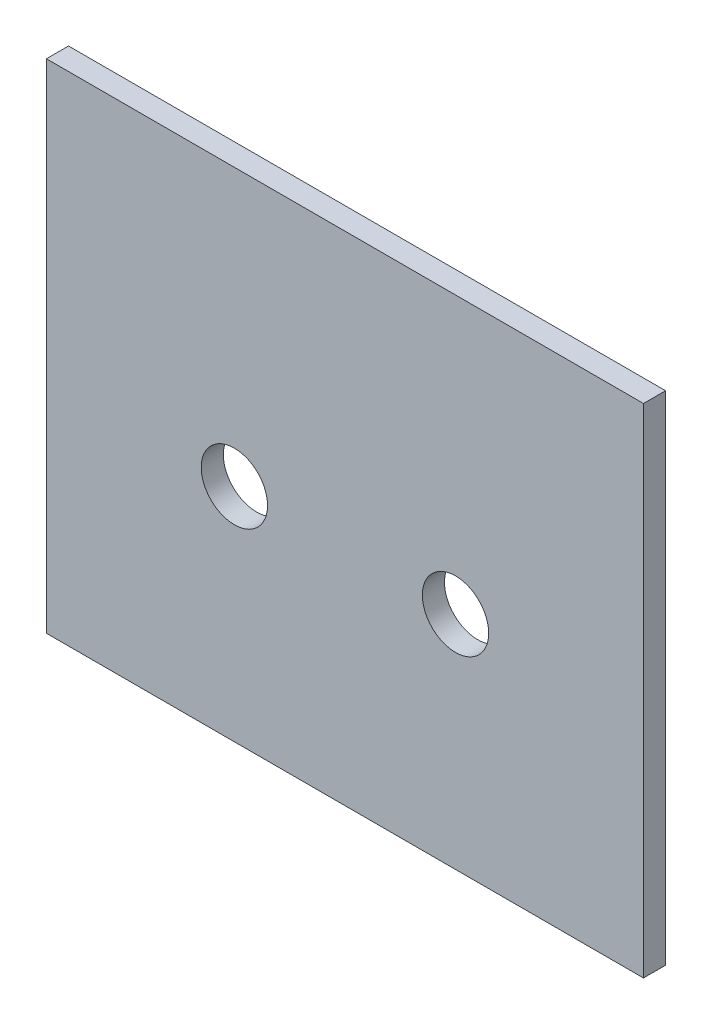
ISO-10303-21;
HEADER;
FILE_DESCRIPTION(('STEP AP214'),'2;1');
FILE_NAME('part.step','',(''),(''),'','','');
FILE_SCHEMA(('AUTOMOTIVE_DESIGN { 1 0 10303 214 1 1 1 1 }'));
ENDSEC;
DATA;
#1=APPLICATION_CONTEXT('core data for automotive mechanical design processes');
#2=APPLICATION_PROTOCOL_DEFINITION('international standard','automotive_design',2000,#1);
#3=PRODUCT_CONTEXT('',#1,'mechanical');
#4=PRODUCT('Part','Part','',(#3));
#5=PRODUCT_RELATED_PRODUCT_CATEGORY('part','',(#4));
#6=PRODUCT_DEFINITION_FORMATION('','',#4);
#7=PRODUCT_DEFINITION_CONTEXT('part definition',#1,'design');
#8=PRODUCT_DEFINITION('design','',#6,#7);
#9=PRODUCT_DEFINITION_SHAPE('','',#8);
#10=(LENGTH_UNIT() NAMED_UNIT(*) SI_UNIT(.MILLI.,.METRE.));
#11=(NAMED_UNIT(*) PLANE_ANGLE_UNIT() SI_UNIT($,.RADIAN.));
#12=(NAMED_UNIT(*) SI_UNIT($,.STERADIAN.) SOLID_ANGLE_UNIT());
#13=UNCERTAINTY_MEASURE_WITH_UNIT(LENGTH_MEASURE(1.E-05),#10,'distance_accuracy_value','');
#14=(GEOMETRIC_REPRESENTATION_CONTEXT(3) GLOBAL_UNCERTAINTY_ASSIGNED_CONTEXT((#13)) GLOBAL_UNIT_ASSIGNED_CONTEXT((#10,
#11,#12)) REPRESENTATION_CONTEXT('',''));
#15=CARTESIAN_POINT('',(0.,0.,0.));
#16=DIRECTION('',(0.,0.,1.));
#17=DIRECTION('',(1.,0.,0.));
#18=AXIS2_PLACEMENT_3D('',#15,#16,#17);
#19=CARTESIAN_POINT('',(0.,0.,-10.));
#20=DIRECTION('',(1.,0.,0.));
#21=DIRECTION('',(0.,0.,-1.));
#22=AXIS2_PLACEMENT_3D('',#19,#20,#21);
#23=PLANE('',#22);
#24=DIRECTION('',(0.,1.,0.));
#25=VECTOR('',#24,1.);
#26=CARTESIAN_POINT('',(0.,0.,0.));
#27=LINE('',#26,#25);
#28=CARTESIAN_POINT('',(0.,0.,0.));
#29=VERTEX_POINT('',#28);
#30=CARTESIAN_POINT('',(0.,225.,0.));
#31=VERTEX_POINT('',#30);
#32=EDGE_CURVE('E107',#29,#31,#27,.T.);
#33=ORIENTED_EDGE('',*,*,#32,.T.);
#34=DIRECTION('',(0.,0.,1.));
#35=VECTOR('',#34,1.);
#36=CARTESIAN_POINT('',(0.,225.,-10.));
#37=LINE('',#36,#35);
#38=CARTESIAN_POINT('',(0.,225.,-10.));
#39=VERTEX_POINT('',#38);
#40=EDGE_CURVE('E11',#39,#31,#37,.T.);
#41=ORIENTED_EDGE('',*,*,#40,.F.);
#42=DIRECTION('',(0.,1.,0.));
#43=VECTOR('',#42,1.);
#44=CARTESIAN_POINT('',(0.,0.,-10.));
#45=LINE('',#44,#43);
#46=CARTESIAN_POINT('',(0.,0.,-10.));
#47=VERTEX_POINT('',#46);
#48=EDGE_CURVE('E94',#47,#39,#45,.T.);
#49=ORIENTED_EDGE('',*,*,#48,.F.);
#50=DIRECTION('',(0.,0.,1.));
#51=VECTOR('',#50,1.);
#52=CARTESIAN_POINT('',(0.,0.,-10.));
#53=LINE('',#52,#51);
#54=EDGE_CURVE('E38',#47,#29,#53,.T.);
#55=ORIENTED_EDGE('',*,*,#54,.T.);
#56=EDGE_LOOP('',(#33,#41,#49,#55));
#57=FACE_BOUND('',#56,.T.);
#58=ADVANCED_FACE('F34',(#57),#23,.F.);
#59=CARTESIAN_POINT('',(0.,225.,-10.));
#60=DIRECTION('',(0.,-1.,0.));
#61=DIRECTION('',(0.,0.,-1.));
#62=AXIS2_PLACEMENT_3D('',#59,#60,#61);
#63=PLANE('',#62);
#64=DIRECTION('',(1.,0.,0.));
#65=VECTOR('',#64,1.);
#66=CARTESIAN_POINT('',(0.,225.,0.));
#67=LINE('',#66,#65);
#68=CARTESIAN_POINT('',(270.,225.,0.));
#69=VERTEX_POINT('',#68);
#70=EDGE_CURVE('E74',#31,#69,#67,.T.);
#71=ORIENTED_EDGE('',*,*,#70,.T.);
#72=DIRECTION('',(0.,0.,1.));
#73=VECTOR('',#72,1.);
#74=CARTESIAN_POINT('',(270.,225.,-10.));
#75=LINE('',#74,#73);
#76=CARTESIAN_POINT('',(270.,225.,-10.));
#77=VERTEX_POINT('',#76);
#78=EDGE_CURVE('E44',#77,#69,#75,.T.);
#79=ORIENTED_EDGE('',*,*,#78,.F.);
#80=DIRECTION('',(1.,0.,0.));
#81=VECTOR('',#80,1.);
#82=CARTESIAN_POINT('',(0.,225.,-10.));
#83=LINE('',#82,#81);
#84=EDGE_CURVE('E52',#39,#77,#83,.T.);
#85=ORIENTED_EDGE('',*,*,#84,.F.);
#86=ORIENTED_EDGE('',*,*,#40,.T.);
#87=EDGE_LOOP('',(#71,#79,#85,#86));
#88=FACE_BOUND('',#87,.T.);
#89=ADVANCED_FACE('F134',(#88),#63,.F.);
#90=CARTESIAN_POINT('',(270.,0.,-10.));
#91=DIRECTION('',(1.,0.,0.));
#92=DIRECTION('',(0.,0.,-1.));
#93=AXIS2_PLACEMENT_3D('',#90,#91,#92);
#94=PLANE('',#93);
#95=DIRECTION('',(0.,1.,0.));
#96=VECTOR('',#95,1.);
#97=CARTESIAN_POINT('',(270.,0.,0.));
#98=LINE('',#97,#96);
#99=CARTESIAN_POINT('',(270.,0.,0.));
#100=VERTEX_POINT('',#99);
#101=EDGE_CURVE('E86',#100,#69,#98,.T.);
#102=ORIENTED_EDGE('',*,*,#101,.F.);
#103=DIRECTION('',(0.,0.,1.));
#104=VECTOR('',#103,1.);
#105=CARTESIAN_POINT('',(270.,0.,-10.));
#106=LINE('',#105,#104);
#107=CARTESIAN_POINT('',(270.,0.,-10.));
#108=VERTEX_POINT('',#107);
#109=EDGE_CURVE('E82',#108,#100,#106,.T.);
#110=ORIENTED_EDGE('',*,*,#109,.F.);
#111=DIRECTION('',(0.,1.,0.));
#112=VECTOR('',#111,1.);
#113=CARTESIAN_POINT('',(270.,0.,-10.));
#114=LINE('',#113,#112);
#115=EDGE_CURVE('E85',#108,#77,#114,.T.);
#116=ORIENTED_EDGE('',*,*,#115,.T.);
#117=ORIENTED_EDGE('',*,*,#78,.T.);
#118=EDGE_LOOP('',(#102,#110,#116,#117));
#119=FACE_BOUND('',#118,.T.);
#120=ADVANCED_FACE('F84',(#119),#94,.T.);
#121=CARTESIAN_POINT('',(185.,100.,-10.));
#122=DIRECTION('',(0.,0.,1.));
#123=DIRECTION('',(1.,0.,0.));
#124=AXIS2_PLACEMENT_3D('',#121,#122,#123);
#125=CYLINDRICAL_SURFACE('',#124,15.);
#126=CARTESIAN_POINT('',(185.,100.,-10.));
#127=DIRECTION('',(0.,0.,1.));
#128=DIRECTION('',(1.,0.,0.));
#129=AXIS2_PLACEMENT_3D('',#126,#127,#128);
#130=CIRCLE('',#129,15.);
#131=CARTESIAN_POINT('',(200.,100.,-10.));
#132=VERTEX_POINT('',#131);
#133=EDGE_CURVE('E96',#132,#132,#130,.T.);
#134=ORIENTED_EDGE('',*,*,#133,.F.);
#135=EDGE_LOOP('',(#134));
#136=FACE_BOUND('',#135,.T.);
#137=CARTESIAN_POINT('',(185.,100.,0.));
#138=DIRECTION('',(0.,0.,1.));
#139=DIRECTION('',(1.,0.,0.));
#140=AXIS2_PLACEMENT_3D('',#137,#138,#139);
#141=CIRCLE('',#140,15.);
#142=CARTESIAN_POINT('',(200.,100.,0.));
#143=VERTEX_POINT('',#142);
#144=EDGE_CURVE('E104',#143,#143,#141,.T.);
#145=ORIENTED_EDGE('',*,*,#144,.T.);
#146=EDGE_LOOP('',(#145));
#147=FACE_BOUND('',#146,.T.);
#148=ADVANCED_FACE('F123',(#136,#147),#125,.F.);
#149=CARTESIAN_POINT('',(85.,100.,-10.));
#150=DIRECTION('',(0.,0.,1.));
#151=DIRECTION('',(1.,0.,0.));
#152=AXIS2_PLACEMENT_3D('',#149,#150,#151);
#153=CYLINDRICAL_SURFACE('',#152,15.);
#154=CARTESIAN_POINT('',(85.,100.,-10.));
#155=DIRECTION('',(0.,0.,1.));
#156=DIRECTION('',(1.,0.,0.));
#157=AXIS2_PLACEMENT_3D('',#154,#155,#156);
#158=CIRCLE('',#157,15.);
#159=CARTESIAN_POINT('',(100.,100.,-10.));
#160=VERTEX_POINT('',#159);
#161=EDGE_CURVE('E113',#160,#160,#158,.T.);
#162=ORIENTED_EDGE('',*,*,#161,.F.);
#163=EDGE_LOOP('',(#162));
#164=FACE_BOUND('',#163,.T.);
#165=CARTESIAN_POINT('',(85.,100.,0.));
#166=DIRECTION('',(0.,0.,1.));
#167=DIRECTION('',(1.,0.,0.));
#168=AXIS2_PLACEMENT_3D('',#165,#166,#167);
#169=CIRCLE('',#168,15.);
#170=CARTESIAN_POINT('',(100.,100.,0.));
#171=VERTEX_POINT('',#170);
#172=EDGE_CURVE('E101',#171,#171,#169,.T.);
#173=ORIENTED_EDGE('',*,*,#172,.T.);
#174=EDGE_LOOP('',(#173));
#175=FACE_BOUND('',#174,.T.);
#176=ADVANCED_FACE('F36',(#164,#175),#153,.F.);
#177=CARTESIAN_POINT('',(0.,0.,-10.));
#178=DIRECTION('',(0.,-1.,0.));
#179=DIRECTION('',(0.,0.,-1.));
#180=AXIS2_PLACEMENT_3D('',#177,#178,#179);
#181=PLANE('',#180);
#182=DIRECTION('',(1.,0.,0.));
#183=VECTOR('',#182,1.);
#184=CARTESIAN_POINT('',(0.,0.,0.));
#185=LINE('',#184,#183);
#186=EDGE_CURVE('E110',#29,#100,#185,.T.);
#187=ORIENTED_EDGE('',*,*,#186,.F.);
#188=ORIENTED_EDGE('',*,*,#54,.F.);
#189=DIRECTION('',(1.,0.,0.));
#190=VECTOR('',#189,1.);
#191=CARTESIAN_POINT('',(0.,0.,-10.));
#192=LINE('',#191,#190);
#193=EDGE_CURVE('E91',#47,#108,#192,.T.);
#194=ORIENTED_EDGE('',*,*,#193,.T.);
#195=ORIENTED_EDGE('',*,*,#109,.T.);
#196=EDGE_LOOP('',(#187,#188,#194,#195));
#197=FACE_BOUND('',#196,.T.);
#198=ADVANCED_FACE('F93',(#197),#181,.T.);
#199=CARTESIAN_POINT('',(0.,0.,-10.));
#200=DIRECTION('',(0.,0.,1.));
#201=DIRECTION('',(1.,0.,0.));
#202=AXIS2_PLACEMENT_3D('',#199,#200,#201);
#203=PLANE('',#202);
#204=ORIENTED_EDGE('',*,*,#161,.T.);
#205=EDGE_LOOP('',(#204));
#206=FACE_BOUND('',#205,.T.);
#207=ORIENTED_EDGE('',*,*,#133,.T.);
#208=EDGE_LOOP('',(#207));
#209=FACE_BOUND('',#208,.T.);
#210=ORIENTED_EDGE('',*,*,#48,.T.);
#211=ORIENTED_EDGE('',*,*,#84,.T.);
#212=ORIENTED_EDGE('',*,*,#115,.F.);
#213=ORIENTED_EDGE('',*,*,#193,.F.);
#214=EDGE_LOOP('',(#210,#211,#212,#213));
#215=FACE_BOUND('',#214,.T.);
#216=ADVANCED_FACE('F90',(#206,#209,#215),#203,.F.);
#217=CARTESIAN_POINT('',(0.,0.,0.));
#218=DIRECTION('',(0.,0.,1.));
#219=DIRECTION('',(1.,0.,0.));
#220=AXIS2_PLACEMENT_3D('',#217,#218,#219);
#221=PLANE('',#220);
#222=ORIENTED_EDGE('',*,*,#172,.F.);
#223=EDGE_LOOP('',(#222));
#224=FACE_BOUND('',#223,.T.);
#225=ORIENTED_EDGE('',*,*,#144,.F.);
#226=EDGE_LOOP('',(#225));
#227=FACE_BOUND('',#226,.T.);
#228=ORIENTED_EDGE('',*,*,#32,.F.);
#229=ORIENTED_EDGE('',*,*,#186,.T.);
#230=ORIENTED_EDGE('',*,*,#101,.T.);
#231=ORIENTED_EDGE('',*,*,#70,.F.);
#232=EDGE_LOOP('',(#228,#229,#230,#231));
#233=FACE_BOUND('',#232,.T.);
#234=ADVANCED_FACE('F128',(#224,#227,#233),#221,.T.);
#235=CLOSED_SHELL('',(#58,#89,#120,#148,#176,#198,#216,#234));
#236=MANIFOLD_SOLID_BREP('B2',#235);
#237=ADVANCED_BREP_SHAPE_REPRESENTATION('',(#18,#236),#14);
#238=SHAPE_DEFINITION_REPRESENTATION(#9,#237);
ENDSEC;
END-ISO-10303-21;
